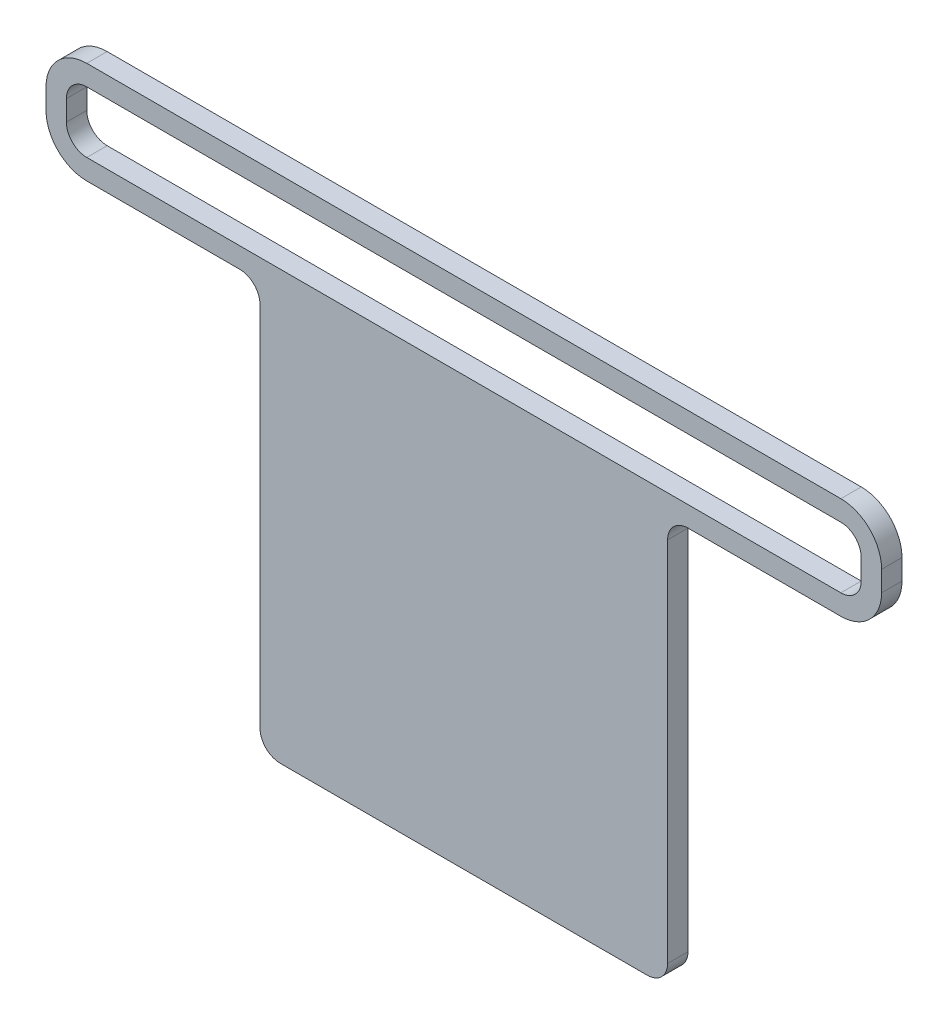
ISO-10303-21;
HEADER;
FILE_DESCRIPTION(('STEP AP214'),'2;1');
FILE_NAME('part.step','',(''),(''),'','','');
FILE_SCHEMA(('AUTOMOTIVE_DESIGN { 1 0 10303 214 1 1 1 1 }'));
ENDSEC;
DATA;
#1=APPLICATION_CONTEXT('core data for automotive mechanical design processes');
#2=APPLICATION_PROTOCOL_DEFINITION('international standard','automotive_design',2000,#1);
#3=PRODUCT_CONTEXT('',#1,'mechanical');
#4=PRODUCT('Part','Part','',(#3));
#5=PRODUCT_RELATED_PRODUCT_CATEGORY('part','',(#4));
#6=PRODUCT_DEFINITION_FORMATION('','',#4);
#7=PRODUCT_DEFINITION_CONTEXT('part definition',#1,'design');
#8=PRODUCT_DEFINITION('design','',#6,#7);
#9=PRODUCT_DEFINITION_SHAPE('','',#8);
#10=(LENGTH_UNIT() NAMED_UNIT(*) SI_UNIT(.MILLI.,.METRE.));
#11=(NAMED_UNIT(*) PLANE_ANGLE_UNIT() SI_UNIT($,.RADIAN.));
#12=(NAMED_UNIT(*) SI_UNIT($,.STERADIAN.) SOLID_ANGLE_UNIT());
#13=UNCERTAINTY_MEASURE_WITH_UNIT(LENGTH_MEASURE(1.E-05),#10,'distance_accuracy_value','');
#14=(GEOMETRIC_REPRESENTATION_CONTEXT(3) GLOBAL_UNCERTAINTY_ASSIGNED_CONTEXT((#13)) GLOBAL_UNIT_ASSIGNED_CONTEXT((#10,
#11,#12)) REPRESENTATION_CONTEXT('',''));
#15=CARTESIAN_POINT('',(0.,0.,0.));
#16=DIRECTION('',(0.,0.,1.));
#17=DIRECTION('',(1.,0.,0.));
#18=AXIS2_PLACEMENT_3D('',#15,#16,#17);
#19=CARTESIAN_POINT('',(143.204419889503,15.,5.));
#20=DIRECTION('',(0.,0.,-1.));
#21=DIRECTION('',(-1.,0.,0.));
#22=AXIS2_PLACEMENT_3D('',#19,#20,#21);
#23=PLANE('',#22);
#24=CARTESIAN_POINT('',(143.204419889503,15.,5.));
#25=DIRECTION('',(0.,0.,1.));
#26=DIRECTION('',(-1.,0.,0.));
#27=AXIS2_PLACEMENT_3D('',#24,#25,#26);
#28=CIRCLE('',#27,10.);
#29=CARTESIAN_POINT('',(153.204419889503,15.,5.));
#30=VERTEX_POINT('',#29);
#31=CARTESIAN_POINT('',(143.204419889503,25.,5.));
#32=VERTEX_POINT('',#31);
#33=EDGE_CURVE('E261',#30,#32,#28,.T.);
#34=ORIENTED_EDGE('',*,*,#33,.T.);
#35=DIRECTION('',(-1.,0.,0.));
#36=VECTOR('',#35,1.);
#37=CARTESIAN_POINT('',(-41.7955801104972,25.,5.));
#38=LINE('',#37,#36);
#39=CARTESIAN_POINT('',(-41.7955801104972,25.,5.));
#40=VERTEX_POINT('',#39);
#41=EDGE_CURVE('E264',#32,#40,#38,.T.);
#42=ORIENTED_EDGE('',*,*,#41,.T.);
#43=CARTESIAN_POINT('',(-41.7955801104972,15.,5.));
#44=DIRECTION('',(0.,0.,1.));
#45=DIRECTION('',(1.,0.,0.));
#46=AXIS2_PLACEMENT_3D('',#43,#44,#45);
#47=CIRCLE('',#46,10.);
#48=CARTESIAN_POINT('',(-51.7955801104972,14.9999999999999,5.));
#49=VERTEX_POINT('',#48);
#50=EDGE_CURVE('E267',#40,#49,#47,.T.);
#51=ORIENTED_EDGE('',*,*,#50,.T.);
#52=DIRECTION('',(0.,-1.,0.));
#53=VECTOR('',#52,1.);
#54=CARTESIAN_POINT('',(-51.7955801104972,14.9999999999999,5.));
#55=LINE('',#54,#53);
#56=CARTESIAN_POINT('',(-51.7955801104972,10.0000000000001,5.));
#57=VERTEX_POINT('',#56);
#58=EDGE_CURVE('E269',#49,#57,#55,.T.);
#59=ORIENTED_EDGE('',*,*,#58,.T.);
#60=CARTESIAN_POINT('',(-41.7955801104972,10.,5.));
#61=DIRECTION('',(0.,0.,1.));
#62=DIRECTION('',(1.,0.,0.));
#63=AXIS2_PLACEMENT_3D('',#60,#61,#62);
#64=CIRCLE('',#63,10.);
#65=CARTESIAN_POINT('',(-41.7955801104972,0.,5.));
#66=VERTEX_POINT('',#65);
#67=EDGE_CURVE('E271',#57,#66,#64,.T.);
#68=ORIENTED_EDGE('',*,*,#67,.T.);
#69=DIRECTION('',(1.,0.,0.));
#70=VECTOR('',#69,1.);
#71=CARTESIAN_POINT('',(-41.7955801104972,0.,5.));
#72=LINE('',#71,#70);
#73=CARTESIAN_POINT('',(-4.29558011049723,0.,5.));
#74=VERTEX_POINT('',#73);
#75=EDGE_CURVE('E273',#66,#74,#72,.T.);
#76=ORIENTED_EDGE('',*,*,#75,.T.);
#77=CARTESIAN_POINT('',(-4.29558011049723,-5.,5.));
#78=DIRECTION('',(0.,0.,-1.));
#79=DIRECTION('',(-1.,0.,0.));
#80=AXIS2_PLACEMENT_3D('',#77,#78,#79);
#81=CIRCLE('',#80,5.);
#82=CARTESIAN_POINT('',(0.704419889502775,-5.,5.));
#83=VERTEX_POINT('',#82);
#84=EDGE_CURVE('E275',#74,#83,#81,.T.);
#85=ORIENTED_EDGE('',*,*,#84,.T.);
#86=DIRECTION('',(0.,-1.,0.));
#87=VECTOR('',#86,1.);
#88=CARTESIAN_POINT('',(0.704419889502775,-5.,5.));
#89=LINE('',#88,#87);
#90=CARTESIAN_POINT('',(0.704419889502785,-95.,5.));
#91=VERTEX_POINT('',#90);
#92=EDGE_CURVE('E277',#83,#91,#89,.T.);
#93=ORIENTED_EDGE('',*,*,#92,.T.);
#94=CARTESIAN_POINT('',(5.70441988950279,-95.,5.));
#95=DIRECTION('',(0.,0.,1.));
#96=DIRECTION('',(1.,0.,0.));
#97=AXIS2_PLACEMENT_3D('',#94,#95,#96);
#98=CIRCLE('',#97,5.);
#99=CARTESIAN_POINT('',(5.70441988950278,-100.,5.));
#100=VERTEX_POINT('',#99);
#101=EDGE_CURVE('E279',#91,#100,#98,.T.);
#102=ORIENTED_EDGE('',*,*,#101,.T.);
#103=DIRECTION('',(1.,0.,0.));
#104=VECTOR('',#103,1.);
#105=CARTESIAN_POINT('',(5.70441988950279,-100.,5.));
#106=LINE('',#105,#104);
#107=CARTESIAN_POINT('',(95.7044198895028,-100.,5.));
#108=VERTEX_POINT('',#107);
#109=EDGE_CURVE('E281',#100,#108,#106,.T.);
#110=ORIENTED_EDGE('',*,*,#109,.T.);
#111=CARTESIAN_POINT('',(95.7044198895028,-95.,5.));
#112=DIRECTION('',(0.,0.,1.));
#113=DIRECTION('',(1.,0.,0.));
#114=AXIS2_PLACEMENT_3D('',#111,#112,#113);
#115=CIRCLE('',#114,5.);
#116=CARTESIAN_POINT('',(100.704419889503,-95.,5.));
#117=VERTEX_POINT('',#116);
#118=EDGE_CURVE('E283',#108,#117,#115,.T.);
#119=ORIENTED_EDGE('',*,*,#118,.T.);
#120=DIRECTION('',(0.,1.,0.));
#121=VECTOR('',#120,1.);
#122=CARTESIAN_POINT('',(100.704419889503,-5.,5.));
#123=LINE('',#122,#121);
#124=CARTESIAN_POINT('',(100.704419889503,-5.,5.));
#125=VERTEX_POINT('',#124);
#126=EDGE_CURVE('E285',#117,#125,#123,.T.);
#127=ORIENTED_EDGE('',*,*,#126,.T.);
#128=CARTESIAN_POINT('',(105.704419889503,-5.,5.));
#129=DIRECTION('',(0.,0.,-1.));
#130=DIRECTION('',(1.,0.,0.));
#131=AXIS2_PLACEMENT_3D('',#128,#129,#130);
#132=CIRCLE('',#131,5.);
#133=CARTESIAN_POINT('',(105.704419889503,0.,5.));
#134=VERTEX_POINT('',#133);
#135=EDGE_CURVE('E287',#125,#134,#132,.T.);
#136=ORIENTED_EDGE('',*,*,#135,.T.);
#137=DIRECTION('',(1.,0.,0.));
#138=VECTOR('',#137,1.);
#139=CARTESIAN_POINT('',(105.704419889503,0.,5.));
#140=LINE('',#139,#138);
#141=CARTESIAN_POINT('',(143.204419889503,0.,5.));
#142=VERTEX_POINT('',#141);
#143=EDGE_CURVE('E289',#134,#142,#140,.T.);
#144=ORIENTED_EDGE('',*,*,#143,.T.);
#145=CARTESIAN_POINT('',(143.204419889503,10.,5.));
#146=DIRECTION('',(0.,0.,1.));
#147=DIRECTION('',(1.,0.,0.));
#148=AXIS2_PLACEMENT_3D('',#145,#146,#147);
#149=CIRCLE('',#148,10.);
#150=CARTESIAN_POINT('',(153.204419889503,10.,5.));
#151=VERTEX_POINT('',#150);
#152=EDGE_CURVE('E291',#142,#151,#149,.T.);
#153=ORIENTED_EDGE('',*,*,#152,.T.);
#154=DIRECTION('',(0.,1.,0.));
#155=VECTOR('',#154,1.);
#156=CARTESIAN_POINT('',(153.204419889503,15.,5.));
#157=LINE('',#156,#155);
#158=EDGE_CURVE('E293',#151,#30,#157,.T.);
#159=ORIENTED_EDGE('',*,*,#158,.T.);
#160=EDGE_LOOP('',(#34,#42,#51,#59,#68,#76,#85,#93,#102,#110,#119,#127,#136,#144,#153,#159));
#161=FACE_BOUND('',#160,.T.);
#162=CARTESIAN_POINT('',(-41.7955801104972,15.,5.));
#163=DIRECTION('',(0.,0.,1.));
#164=DIRECTION('',(1.,0.,0.));
#165=AXIS2_PLACEMENT_3D('',#162,#163,#164);
#166=CIRCLE('',#165,5.);
#167=CARTESIAN_POINT('',(-41.7955801104972,20.,5.));
#168=VERTEX_POINT('',#167);
#169=CARTESIAN_POINT('',(-46.7955801104972,15.,5.));
#170=VERTEX_POINT('',#169);
#171=EDGE_CURVE('E196',#168,#170,#166,.T.);
#172=ORIENTED_EDGE('',*,*,#171,.F.);
#173=DIRECTION('',(-1.,0.,0.));
#174=VECTOR('',#173,1.);
#175=CARTESIAN_POINT('',(-41.7955801104972,20.,5.));
#176=LINE('',#175,#174);
#177=CARTESIAN_POINT('',(143.204419889503,20.,5.));
#178=VERTEX_POINT('',#177);
#179=EDGE_CURVE('E229',#178,#168,#176,.T.);
#180=ORIENTED_EDGE('',*,*,#179,.F.);
#181=CARTESIAN_POINT('',(143.204419889503,15.,5.));
#182=DIRECTION('',(0.,0.,1.));
#183=DIRECTION('',(-1.,0.,0.));
#184=AXIS2_PLACEMENT_3D('',#181,#182,#183);
#185=CIRCLE('',#184,5.);
#186=CARTESIAN_POINT('',(148.204419889503,15.,5.));
#187=VERTEX_POINT('',#186);
#188=EDGE_CURVE('E227',#187,#178,#185,.T.);
#189=ORIENTED_EDGE('',*,*,#188,.F.);
#190=DIRECTION('',(0.,1.,0.));
#191=VECTOR('',#190,1.);
#192=CARTESIAN_POINT('',(148.204419889503,15.,5.));
#193=LINE('',#192,#191);
#194=CARTESIAN_POINT('',(148.204419889503,10.,5.));
#195=VERTEX_POINT('',#194);
#196=EDGE_CURVE('E225',#195,#187,#193,.T.);
#197=ORIENTED_EDGE('',*,*,#196,.F.);
#198=CARTESIAN_POINT('',(143.204419889503,10.,5.));
#199=DIRECTION('',(0.,0.,1.));
#200=DIRECTION('',(1.,0.,0.));
#201=AXIS2_PLACEMENT_3D('',#198,#199,#200);
#202=CIRCLE('',#201,5.);
#203=CARTESIAN_POINT('',(143.204419889503,5.,5.));
#204=VERTEX_POINT('',#203);
#205=EDGE_CURVE('E223',#204,#195,#202,.T.);
#206=ORIENTED_EDGE('',*,*,#205,.F.);
#207=DIRECTION('',(1.,0.,0.));
#208=VECTOR('',#207,1.);
#209=CARTESIAN_POINT('',(-41.7955801104972,5.,5.));
#210=LINE('',#209,#208);
#211=CARTESIAN_POINT('',(-41.7955801104972,5.,5.));
#212=VERTEX_POINT('',#211);
#213=EDGE_CURVE('E219',#212,#204,#210,.T.);
#214=ORIENTED_EDGE('',*,*,#213,.F.);
#215=CARTESIAN_POINT('',(-41.7955801104972,10.,5.));
#216=DIRECTION('',(0.,0.,1.));
#217=DIRECTION('',(1.,0.,0.));
#218=AXIS2_PLACEMENT_3D('',#215,#216,#217);
#219=CIRCLE('',#218,5.);
#220=CARTESIAN_POINT('',(-46.7955801104972,10.,5.));
#221=VERTEX_POINT('',#220);
#222=EDGE_CURVE('E217',#221,#212,#219,.T.);
#223=ORIENTED_EDGE('',*,*,#222,.F.);
#224=DIRECTION('',(0.,-1.,0.));
#225=VECTOR('',#224,1.);
#226=CARTESIAN_POINT('',(-46.7955801104972,15.,5.));
#227=LINE('',#226,#225);
#228=EDGE_CURVE('E204',#170,#221,#227,.T.);
#229=ORIENTED_EDGE('',*,*,#228,.F.);
#230=EDGE_LOOP('',(#172,#180,#189,#197,#206,#214,#223,#229));
#231=FACE_BOUND('',#230,.T.);
#232=ADVANCED_FACE('F35',(#161,#231),#23,.F.);
#233=CARTESIAN_POINT('',(143.204419889503,15.,0.));
#234=DIRECTION('',(0.,0.,-1.));
#235=DIRECTION('',(-1.,0.,0.));
#236=AXIS2_PLACEMENT_3D('',#233,#234,#235);
#237=PLANE('',#236);
#238=CARTESIAN_POINT('',(143.204419889503,15.,0.));
#239=DIRECTION('',(0.,0.,1.));
#240=DIRECTION('',(-1.,0.,0.));
#241=AXIS2_PLACEMENT_3D('',#238,#239,#240);
#242=CIRCLE('',#241,10.);
#243=CARTESIAN_POINT('',(153.204419889503,15.,0.));
#244=VERTEX_POINT('',#243);
#245=CARTESIAN_POINT('',(143.204419889503,25.,0.));
#246=VERTEX_POINT('',#245);
#247=EDGE_CURVE('E212',#244,#246,#242,.T.);
#248=ORIENTED_EDGE('',*,*,#247,.F.);
#249=DIRECTION('',(0.,1.,0.));
#250=VECTOR('',#249,1.);
#251=CARTESIAN_POINT('',(153.204419889503,15.,0.));
#252=LINE('',#251,#250);
#253=CARTESIAN_POINT('',(153.204419889503,10.,0.));
#254=VERTEX_POINT('',#253);
#255=EDGE_CURVE('E265',#254,#244,#252,.T.);
#256=ORIENTED_EDGE('',*,*,#255,.F.);
#257=CARTESIAN_POINT('',(143.204419889503,10.,0.));
#258=DIRECTION('',(0.,0.,1.));
#259=DIRECTION('',(1.,0.,0.));
#260=AXIS2_PLACEMENT_3D('',#257,#258,#259);
#261=CIRCLE('',#260,10.);
#262=CARTESIAN_POINT('',(143.204419889503,0.,0.));
#263=VERTEX_POINT('',#262);
#264=EDGE_CURVE('E324',#263,#254,#261,.T.);
#265=ORIENTED_EDGE('',*,*,#264,.F.);
#266=DIRECTION('',(1.,0.,0.));
#267=VECTOR('',#266,1.);
#268=CARTESIAN_POINT('',(105.704419889503,0.,0.));
#269=LINE('',#268,#267);
#270=CARTESIAN_POINT('',(105.704419889503,0.,0.));
#271=VERTEX_POINT('',#270);
#272=EDGE_CURVE('E322',#271,#263,#269,.T.);
#273=ORIENTED_EDGE('',*,*,#272,.F.);
#274=CARTESIAN_POINT('',(105.704419889503,-5.,0.));
#275=DIRECTION('',(0.,0.,-1.));
#276=DIRECTION('',(1.,0.,0.));
#277=AXIS2_PLACEMENT_3D('',#274,#275,#276);
#278=CIRCLE('',#277,5.);
#279=CARTESIAN_POINT('',(100.704419889503,-5.,0.));
#280=VERTEX_POINT('',#279);
#281=EDGE_CURVE('E320',#280,#271,#278,.T.);
#282=ORIENTED_EDGE('',*,*,#281,.F.);
#283=DIRECTION('',(0.,1.,0.));
#284=VECTOR('',#283,1.);
#285=CARTESIAN_POINT('',(100.704419889503,-5.,0.));
#286=LINE('',#285,#284);
#287=CARTESIAN_POINT('',(100.704419889503,-95.,0.));
#288=VERTEX_POINT('',#287);
#289=EDGE_CURVE('E318',#288,#280,#286,.T.);
#290=ORIENTED_EDGE('',*,*,#289,.F.);
#291=CARTESIAN_POINT('',(95.7044198895028,-95.,0.));
#292=DIRECTION('',(0.,0.,1.));
#293=DIRECTION('',(1.,0.,0.));
#294=AXIS2_PLACEMENT_3D('',#291,#292,#293);
#295=CIRCLE('',#294,5.);
#296=CARTESIAN_POINT('',(95.7044198895028,-100.,0.));
#297=VERTEX_POINT('',#296);
#298=EDGE_CURVE('E316',#297,#288,#295,.T.);
#299=ORIENTED_EDGE('',*,*,#298,.F.);
#300=DIRECTION('',(1.,0.,0.));
#301=VECTOR('',#300,1.);
#302=CARTESIAN_POINT('',(5.70441988950279,-100.,0.));
#303=LINE('',#302,#301);
#304=CARTESIAN_POINT('',(5.70441988950278,-100.,0.));
#305=VERTEX_POINT('',#304);
#306=EDGE_CURVE('E314',#305,#297,#303,.T.);
#307=ORIENTED_EDGE('',*,*,#306,.F.);
#308=CARTESIAN_POINT('',(5.70441988950279,-95.,0.));
#309=DIRECTION('',(0.,0.,1.));
#310=DIRECTION('',(1.,0.,0.));
#311=AXIS2_PLACEMENT_3D('',#308,#309,#310);
#312=CIRCLE('',#311,5.);
#313=CARTESIAN_POINT('',(0.704419889502785,-95.,0.));
#314=VERTEX_POINT('',#313);
#315=EDGE_CURVE('E312',#314,#305,#312,.T.);
#316=ORIENTED_EDGE('',*,*,#315,.F.);
#317=DIRECTION('',(0.,-1.,0.));
#318=VECTOR('',#317,1.);
#319=CARTESIAN_POINT('',(0.704419889502775,-5.,0.));
#320=LINE('',#319,#318);
#321=CARTESIAN_POINT('',(0.704419889502775,-5.,0.));
#322=VERTEX_POINT('',#321);
#323=EDGE_CURVE('E310',#322,#314,#320,.T.);
#324=ORIENTED_EDGE('',*,*,#323,.F.);
#325=CARTESIAN_POINT('',(-4.29558011049723,-5.,0.));
#326=DIRECTION('',(0.,0.,-1.));
#327=DIRECTION('',(-1.,0.,0.));
#328=AXIS2_PLACEMENT_3D('',#325,#326,#327);
#329=CIRCLE('',#328,5.);
#330=CARTESIAN_POINT('',(-4.29558011049723,0.,0.));
#331=VERTEX_POINT('',#330);
#332=EDGE_CURVE('E308',#331,#322,#329,.T.);
#333=ORIENTED_EDGE('',*,*,#332,.F.);
#334=DIRECTION('',(1.,0.,0.));
#335=VECTOR('',#334,1.);
#336=CARTESIAN_POINT('',(-41.7955801104972,0.,0.));
#337=LINE('',#336,#335);
#338=CARTESIAN_POINT('',(-41.7955801104972,0.,0.));
#339=VERTEX_POINT('',#338);
#340=EDGE_CURVE('E306',#339,#331,#337,.T.);
#341=ORIENTED_EDGE('',*,*,#340,.F.);
#342=CARTESIAN_POINT('',(-41.7955801104972,10.,0.));
#343=DIRECTION('',(0.,0.,1.));
#344=DIRECTION('',(1.,0.,0.));
#345=AXIS2_PLACEMENT_3D('',#342,#343,#344);
#346=CIRCLE('',#345,10.);
#347=CARTESIAN_POINT('',(-51.7955801104972,10.0000000000001,0.));
#348=VERTEX_POINT('',#347);
#349=EDGE_CURVE('E304',#348,#339,#346,.T.);
#350=ORIENTED_EDGE('',*,*,#349,.F.);
#351=DIRECTION('',(0.,-1.,0.));
#352=VECTOR('',#351,1.);
#353=CARTESIAN_POINT('',(-51.7955801104972,14.9999999999999,0.));
#354=LINE('',#353,#352);
#355=CARTESIAN_POINT('',(-51.7955801104972,14.9999999999999,0.));
#356=VERTEX_POINT('',#355);
#357=EDGE_CURVE('E302',#356,#348,#354,.T.);
#358=ORIENTED_EDGE('',*,*,#357,.F.);
#359=CARTESIAN_POINT('',(-41.7955801104972,15.,0.));
#360=DIRECTION('',(0.,0.,1.));
#361=DIRECTION('',(1.,0.,0.));
#362=AXIS2_PLACEMENT_3D('',#359,#360,#361);
#363=CIRCLE('',#362,10.);
#364=CARTESIAN_POINT('',(-41.7955801104972,25.,0.));
#365=VERTEX_POINT('',#364);
#366=EDGE_CURVE('E300',#365,#356,#363,.T.);
#367=ORIENTED_EDGE('',*,*,#366,.F.);
#368=DIRECTION('',(-1.,0.,0.));
#369=VECTOR('',#368,1.);
#370=CARTESIAN_POINT('',(-41.7955801104972,25.,0.));
#371=LINE('',#370,#369);
#372=EDGE_CURVE('E298',#246,#365,#371,.T.);
#373=ORIENTED_EDGE('',*,*,#372,.F.);
#374=EDGE_LOOP('',(#248,#256,#265,#273,#282,#290,#299,#307,#316,#324,#333,#341,#350,#358,#367,#373));
#375=FACE_BOUND('',#374,.T.);
#376=DIRECTION('',(-1.,0.,0.));
#377=VECTOR('',#376,1.);
#378=CARTESIAN_POINT('',(-41.7955801104972,20.,0.));
#379=LINE('',#378,#377);
#380=CARTESIAN_POINT('',(143.204419889503,20.,0.));
#381=VERTEX_POINT('',#380);
#382=CARTESIAN_POINT('',(-41.7955801104972,20.,0.));
#383=VERTEX_POINT('',#382);
#384=EDGE_CURVE('E205',#381,#383,#379,.T.);
#385=ORIENTED_EDGE('',*,*,#384,.T.);
#386=CARTESIAN_POINT('',(-41.7955801104972,15.,0.));
#387=DIRECTION('',(0.,0.,1.));
#388=DIRECTION('',(1.,0.,0.));
#389=AXIS2_PLACEMENT_3D('',#386,#387,#388);
#390=CIRCLE('',#389,5.);
#391=CARTESIAN_POINT('',(-46.7955801104972,15.,0.));
#392=VERTEX_POINT('',#391);
#393=EDGE_CURVE('E58',#383,#392,#390,.T.);
#394=ORIENTED_EDGE('',*,*,#393,.T.);
#395=DIRECTION('',(0.,-1.,0.));
#396=VECTOR('',#395,1.);
#397=CARTESIAN_POINT('',(-46.7955801104972,15.,0.));
#398=LINE('',#397,#396);
#399=CARTESIAN_POINT('',(-46.7955801104972,10.,0.));
#400=VERTEX_POINT('',#399);
#401=EDGE_CURVE('E211',#392,#400,#398,.T.);
#402=ORIENTED_EDGE('',*,*,#401,.T.);
#403=CARTESIAN_POINT('',(-41.7955801104972,10.,0.));
#404=DIRECTION('',(0.,0.,1.));
#405=DIRECTION('',(1.,0.,0.));
#406=AXIS2_PLACEMENT_3D('',#403,#404,#405);
#407=CIRCLE('',#406,5.);
#408=CARTESIAN_POINT('',(-41.7955801104972,5.,0.));
#409=VERTEX_POINT('',#408);
#410=EDGE_CURVE('E233',#400,#409,#407,.T.);
#411=ORIENTED_EDGE('',*,*,#410,.T.);
#412=DIRECTION('',(1.,0.,0.));
#413=VECTOR('',#412,1.);
#414=CARTESIAN_POINT('',(-41.7955801104972,5.,0.));
#415=LINE('',#414,#413);
#416=CARTESIAN_POINT('',(143.204419889503,5.,0.));
#417=VERTEX_POINT('',#416);
#418=EDGE_CURVE('E236',#409,#417,#415,.T.);
#419=ORIENTED_EDGE('',*,*,#418,.T.);
#420=CARTESIAN_POINT('',(143.204419889503,10.,0.));
#421=DIRECTION('',(0.,0.,1.));
#422=DIRECTION('',(1.,0.,0.));
#423=AXIS2_PLACEMENT_3D('',#420,#421,#422);
#424=CIRCLE('',#423,5.);
#425=CARTESIAN_POINT('',(148.204419889503,10.,0.));
#426=VERTEX_POINT('',#425);
#427=EDGE_CURVE('E239',#417,#426,#424,.T.);
#428=ORIENTED_EDGE('',*,*,#427,.T.);
#429=DIRECTION('',(0.,1.,0.));
#430=VECTOR('',#429,1.);
#431=CARTESIAN_POINT('',(148.204419889503,15.,0.));
#432=LINE('',#431,#430);
#433=CARTESIAN_POINT('',(148.204419889503,15.,0.));
#434=VERTEX_POINT('',#433);
#435=EDGE_CURVE('E242',#426,#434,#432,.T.);
#436=ORIENTED_EDGE('',*,*,#435,.T.);
#437=CARTESIAN_POINT('',(143.204419889503,15.,0.));
#438=DIRECTION('',(0.,0.,1.));
#439=DIRECTION('',(-1.,0.,0.));
#440=AXIS2_PLACEMENT_3D('',#437,#438,#439);
#441=CIRCLE('',#440,5.);
#442=EDGE_CURVE('E245',#434,#381,#441,.T.);
#443=ORIENTED_EDGE('',*,*,#442,.T.);
#444=EDGE_LOOP('',(#385,#394,#402,#411,#419,#428,#436,#443));
#445=FACE_BOUND('',#444,.T.);
#446=ADVANCED_FACE('F378',(#375,#445),#237,.T.);
#447=CARTESIAN_POINT('',(143.204419889503,15.,5.));
#448=DIRECTION('',(0.,0.,-1.));
#449=DIRECTION('',(-1.,0.,0.));
#450=AXIS2_PLACEMENT_3D('',#447,#448,#449);
#451=CYLINDRICAL_SURFACE('',#450,10.);
#452=ORIENTED_EDGE('',*,*,#247,.T.);
#453=DIRECTION('',(0.,0.,-1.));
#454=VECTOR('',#453,1.);
#455=CARTESIAN_POINT('',(143.204419889503,25.,5.));
#456=LINE('',#455,#454);
#457=EDGE_CURVE('E11',#32,#246,#456,.T.);
#458=ORIENTED_EDGE('',*,*,#457,.F.);
#459=ORIENTED_EDGE('',*,*,#33,.F.);
#460=DIRECTION('',(0.,0.,-1.));
#461=VECTOR('',#460,1.);
#462=CARTESIAN_POINT('',(153.204419889503,15.,5.));
#463=LINE('',#462,#461);
#464=EDGE_CURVE('E295',#30,#244,#463,.T.);
#465=ORIENTED_EDGE('',*,*,#464,.T.);
#466=EDGE_LOOP('',(#452,#458,#459,#465));
#467=FACE_BOUND('',#466,.T.);
#468=ADVANCED_FACE('F37',(#467),#451,.T.);
#469=CARTESIAN_POINT('',(-41.7955801104972,25.,5.));
#470=DIRECTION('',(0.,-1.,0.));
#471=DIRECTION('',(0.,0.,-1.));
#472=AXIS2_PLACEMENT_3D('',#469,#470,#471);
#473=PLANE('',#472);
#474=ORIENTED_EDGE('',*,*,#372,.T.);
#475=DIRECTION('',(0.,0.,-1.));
#476=VECTOR('',#475,1.);
#477=CARTESIAN_POINT('',(-41.7955801104972,25.,5.));
#478=LINE('',#477,#476);
#479=EDGE_CURVE('E43',#40,#365,#478,.T.);
#480=ORIENTED_EDGE('',*,*,#479,.F.);
#481=ORIENTED_EDGE('',*,*,#41,.F.);
#482=ORIENTED_EDGE('',*,*,#457,.T.);
#483=EDGE_LOOP('',(#474,#480,#481,#482));
#484=FACE_BOUND('',#483,.T.);
#485=ADVANCED_FACE('F395',(#484),#473,.F.);
#486=CARTESIAN_POINT('',(-41.7955801104972,15.,5.));
#487=DIRECTION('',(0.,0.,-1.));
#488=DIRECTION('',(-1.,0.,0.));
#489=AXIS2_PLACEMENT_3D('',#486,#487,#488);
#490=CYLINDRICAL_SURFACE('',#489,10.);
#491=ORIENTED_EDGE('',*,*,#366,.T.);
#492=DIRECTION('',(0.,0.,-1.));
#493=VECTOR('',#492,1.);
#494=CARTESIAN_POINT('',(-51.7955801104972,14.9999999999999,5.));
#495=LINE('',#494,#493);
#496=EDGE_CURVE('E365',#49,#356,#495,.T.);
#497=ORIENTED_EDGE('',*,*,#496,.F.);
#498=ORIENTED_EDGE('',*,*,#50,.F.);
#499=ORIENTED_EDGE('',*,*,#479,.T.);
#500=EDGE_LOOP('',(#491,#497,#498,#499));
#501=FACE_BOUND('',#500,.T.);
#502=ADVANCED_FACE('F372',(#501),#490,.T.);
#503=CARTESIAN_POINT('',(-51.7955801104972,14.9999999999999,5.));
#504=DIRECTION('',(1.,0.,0.));
#505=DIRECTION('',(0.,0.,-1.));
#506=AXIS2_PLACEMENT_3D('',#503,#504,#505);
#507=PLANE('',#506);
#508=ORIENTED_EDGE('',*,*,#357,.T.);
#509=DIRECTION('',(0.,0.,-1.));
#510=VECTOR('',#509,1.);
#511=CARTESIAN_POINT('',(-51.7955801104972,10.0000000000001,5.));
#512=LINE('',#511,#510);
#513=EDGE_CURVE('E362',#57,#348,#512,.T.);
#514=ORIENTED_EDGE('',*,*,#513,.F.);
#515=ORIENTED_EDGE('',*,*,#58,.F.);
#516=ORIENTED_EDGE('',*,*,#496,.T.);
#517=EDGE_LOOP('',(#508,#514,#515,#516));
#518=FACE_BOUND('',#517,.T.);
#519=ADVANCED_FACE('F384',(#518),#507,.F.);
#520=CARTESIAN_POINT('',(-41.7955801104972,10.,5.));
#521=DIRECTION('',(0.,0.,-1.));
#522=DIRECTION('',(-1.,0.,0.));
#523=AXIS2_PLACEMENT_3D('',#520,#521,#522);
#524=CYLINDRICAL_SURFACE('',#523,10.);
#525=ORIENTED_EDGE('',*,*,#349,.T.);
#526=DIRECTION('',(0.,0.,-1.));
#527=VECTOR('',#526,1.);
#528=CARTESIAN_POINT('',(-41.7955801104972,0.,5.));
#529=LINE('',#528,#527);
#530=EDGE_CURVE('E359',#66,#339,#529,.T.);
#531=ORIENTED_EDGE('',*,*,#530,.F.);
#532=ORIENTED_EDGE('',*,*,#67,.F.);
#533=ORIENTED_EDGE('',*,*,#513,.T.);
#534=EDGE_LOOP('',(#525,#531,#532,#533));
#535=FACE_BOUND('',#534,.T.);
#536=ADVANCED_FACE('F388',(#535),#524,.T.);
#537=CARTESIAN_POINT('',(-41.7955801104972,0.,5.));
#538=DIRECTION('',(0.,1.,0.));
#539=DIRECTION('',(0.,0.,1.));
#540=AXIS2_PLACEMENT_3D('',#537,#538,#539);
#541=PLANE('',#540);
#542=ORIENTED_EDGE('',*,*,#340,.T.);
#543=DIRECTION('',(0.,0.,-1.));
#544=VECTOR('',#543,1.);
#545=CARTESIAN_POINT('',(-4.29558011049723,0.,5.));
#546=LINE('',#545,#544);
#547=EDGE_CURVE('E356',#74,#331,#546,.T.);
#548=ORIENTED_EDGE('',*,*,#547,.F.);
#549=ORIENTED_EDGE('',*,*,#75,.F.);
#550=ORIENTED_EDGE('',*,*,#530,.T.);
#551=EDGE_LOOP('',(#542,#548,#549,#550));
#552=FACE_BOUND('',#551,.T.);
#553=ADVANCED_FACE('F448',(#552),#541,.F.);
#554=CARTESIAN_POINT('',(-4.29558011049723,-5.,5.));
#555=DIRECTION('',(0.,0.,-1.));
#556=DIRECTION('',(-1.,0.,0.));
#557=AXIS2_PLACEMENT_3D('',#554,#555,#556);
#558=CYLINDRICAL_SURFACE('',#557,5.);
#559=ORIENTED_EDGE('',*,*,#332,.T.);
#560=DIRECTION('',(0.,0.,-1.));
#561=VECTOR('',#560,1.);
#562=CARTESIAN_POINT('',(0.704419889502775,-5.,5.));
#563=LINE('',#562,#561);
#564=EDGE_CURVE('E353',#83,#322,#563,.T.);
#565=ORIENTED_EDGE('',*,*,#564,.F.);
#566=ORIENTED_EDGE('',*,*,#84,.F.);
#567=ORIENTED_EDGE('',*,*,#547,.T.);
#568=EDGE_LOOP('',(#559,#565,#566,#567));
#569=FACE_BOUND('',#568,.T.);
#570=ADVANCED_FACE('F445',(#569),#558,.F.);
#571=CARTESIAN_POINT('',(0.704419889502775,-5.,5.));
#572=DIRECTION('',(1.,0.,0.));
#573=DIRECTION('',(0.,1.,0.));
#574=AXIS2_PLACEMENT_3D('',#571,#572,#573);
#575=PLANE('',#574);
#576=ORIENTED_EDGE('',*,*,#323,.T.);
#577=DIRECTION('',(0.,0.,-1.));
#578=VECTOR('',#577,1.);
#579=CARTESIAN_POINT('',(0.704419889502785,-95.,5.));
#580=LINE('',#579,#578);
#581=EDGE_CURVE('E350',#91,#314,#580,.T.);
#582=ORIENTED_EDGE('',*,*,#581,.F.);
#583=ORIENTED_EDGE('',*,*,#92,.F.);
#584=ORIENTED_EDGE('',*,*,#564,.T.);
#585=EDGE_LOOP('',(#576,#582,#583,#584));
#586=FACE_BOUND('',#585,.T.);
#587=ADVANCED_FACE('F441',(#586),#575,.F.);
#588=CARTESIAN_POINT('',(5.70441988950279,-95.,5.));
#589=DIRECTION('',(0.,0.,-1.));
#590=DIRECTION('',(-1.,0.,0.));
#591=AXIS2_PLACEMENT_3D('',#588,#589,#590);
#592=CYLINDRICAL_SURFACE('',#591,5.);
#593=ORIENTED_EDGE('',*,*,#315,.T.);
#594=DIRECTION('',(0.,0.,-1.));
#595=VECTOR('',#594,1.);
#596=CARTESIAN_POINT('',(5.70441988950278,-100.,5.));
#597=LINE('',#596,#595);
#598=EDGE_CURVE('E347',#100,#305,#597,.T.);
#599=ORIENTED_EDGE('',*,*,#598,.F.);
#600=ORIENTED_EDGE('',*,*,#101,.F.);
#601=ORIENTED_EDGE('',*,*,#581,.T.);
#602=EDGE_LOOP('',(#593,#599,#600,#601));
#603=FACE_BOUND('',#602,.T.);
#604=ADVANCED_FACE('F437',(#603),#592,.T.);
#605=CARTESIAN_POINT('',(5.70441988950279,-100.,5.));
#606=DIRECTION('',(0.,1.,0.));
#607=DIRECTION('',(0.,0.,1.));
#608=AXIS2_PLACEMENT_3D('',#605,#606,#607);
#609=PLANE('',#608);
#610=ORIENTED_EDGE('',*,*,#306,.T.);
#611=DIRECTION('',(0.,0.,-1.));
#612=VECTOR('',#611,1.);
#613=CARTESIAN_POINT('',(95.7044198895028,-100.,5.));
#614=LINE('',#613,#612);
#615=EDGE_CURVE('E344',#108,#297,#614,.T.);
#616=ORIENTED_EDGE('',*,*,#615,.F.);
#617=ORIENTED_EDGE('',*,*,#109,.F.);
#618=ORIENTED_EDGE('',*,*,#598,.T.);
#619=EDGE_LOOP('',(#610,#616,#617,#618));
#620=FACE_BOUND('',#619,.T.);
#621=ADVANCED_FACE('F432',(#620),#609,.F.);
#622=CARTESIAN_POINT('',(95.7044198895028,-95.,5.));
#623=DIRECTION('',(0.,0.,-1.));
#624=DIRECTION('',(-1.,0.,0.));
#625=AXIS2_PLACEMENT_3D('',#622,#623,#624);
#626=CYLINDRICAL_SURFACE('',#625,5.);
#627=ORIENTED_EDGE('',*,*,#298,.T.);
#628=DIRECTION('',(0.,0.,-1.));
#629=VECTOR('',#628,1.);
#630=CARTESIAN_POINT('',(100.704419889503,-95.,5.));
#631=LINE('',#630,#629);
#632=EDGE_CURVE('E341',#117,#288,#631,.T.);
#633=ORIENTED_EDGE('',*,*,#632,.F.);
#634=ORIENTED_EDGE('',*,*,#118,.F.);
#635=ORIENTED_EDGE('',*,*,#615,.T.);
#636=EDGE_LOOP('',(#627,#633,#634,#635));
#637=FACE_BOUND('',#636,.T.);
#638=ADVANCED_FACE('F426',(#637),#626,.T.);
#639=CARTESIAN_POINT('',(100.704419889503,-5.,5.));
#640=DIRECTION('',(-1.,0.,0.));
#641=DIRECTION('',(0.,-1.,0.));
#642=AXIS2_PLACEMENT_3D('',#639,#640,#641);
#643=PLANE('',#642);
#644=ORIENTED_EDGE('',*,*,#289,.T.);
#645=DIRECTION('',(0.,0.,-1.));
#646=VECTOR('',#645,1.);
#647=CARTESIAN_POINT('',(100.704419889503,-5.,5.));
#648=LINE('',#647,#646);
#649=EDGE_CURVE('E338',#125,#280,#648,.T.);
#650=ORIENTED_EDGE('',*,*,#649,.F.);
#651=ORIENTED_EDGE('',*,*,#126,.F.);
#652=ORIENTED_EDGE('',*,*,#632,.T.);
#653=EDGE_LOOP('',(#644,#650,#651,#652));
#654=FACE_BOUND('',#653,.T.);
#655=ADVANCED_FACE('F422',(#654),#643,.F.);
#656=CARTESIAN_POINT('',(105.704419889503,-5.,5.));
#657=DIRECTION('',(0.,0.,-1.));
#658=DIRECTION('',(-1.,0.,0.));
#659=AXIS2_PLACEMENT_3D('',#656,#657,#658);
#660=CYLINDRICAL_SURFACE('',#659,5.);
#661=ORIENTED_EDGE('',*,*,#281,.T.);
#662=DIRECTION('',(0.,0.,-1.));
#663=VECTOR('',#662,1.);
#664=CARTESIAN_POINT('',(105.704419889503,0.,5.));
#665=LINE('',#664,#663);
#666=EDGE_CURVE('E335',#134,#271,#665,.T.);
#667=ORIENTED_EDGE('',*,*,#666,.F.);
#668=ORIENTED_EDGE('',*,*,#135,.F.);
#669=ORIENTED_EDGE('',*,*,#649,.T.);
#670=EDGE_LOOP('',(#661,#667,#668,#669));
#671=FACE_BOUND('',#670,.T.);
#672=ADVANCED_FACE('F417',(#671),#660,.F.);
#673=CARTESIAN_POINT('',(105.704419889503,0.,5.));
#674=DIRECTION('',(0.,1.,0.));
#675=DIRECTION('',(0.,0.,1.));
#676=AXIS2_PLACEMENT_3D('',#673,#674,#675);
#677=PLANE('',#676);
#678=ORIENTED_EDGE('',*,*,#272,.T.);
#679=DIRECTION('',(0.,0.,-1.));
#680=VECTOR('',#679,1.);
#681=CARTESIAN_POINT('',(143.204419889503,0.,5.));
#682=LINE('',#681,#680);
#683=EDGE_CURVE('E332',#142,#263,#682,.T.);
#684=ORIENTED_EDGE('',*,*,#683,.F.);
#685=ORIENTED_EDGE('',*,*,#143,.F.);
#686=ORIENTED_EDGE('',*,*,#666,.T.);
#687=EDGE_LOOP('',(#678,#684,#685,#686));
#688=FACE_BOUND('',#687,.T.);
#689=ADVANCED_FACE('F411',(#688),#677,.F.);
#690=CARTESIAN_POINT('',(143.204419889503,10.,5.));
#691=DIRECTION('',(0.,0.,-1.));
#692=DIRECTION('',(-1.,0.,0.));
#693=AXIS2_PLACEMENT_3D('',#690,#691,#692);
#694=CYLINDRICAL_SURFACE('',#693,10.);
#695=ORIENTED_EDGE('',*,*,#264,.T.);
#696=DIRECTION('',(0.,0.,-1.));
#697=VECTOR('',#696,1.);
#698=CARTESIAN_POINT('',(153.204419889503,10.,5.));
#699=LINE('',#698,#697);
#700=EDGE_CURVE('E329',#151,#254,#699,.T.);
#701=ORIENTED_EDGE('',*,*,#700,.F.);
#702=ORIENTED_EDGE('',*,*,#152,.F.);
#703=ORIENTED_EDGE('',*,*,#683,.T.);
#704=EDGE_LOOP('',(#695,#701,#702,#703));
#705=FACE_BOUND('',#704,.T.);
#706=ADVANCED_FACE('F407',(#705),#694,.T.);
#707=CARTESIAN_POINT('',(153.204419889503,15.,5.));
#708=DIRECTION('',(-1.,0.,0.));
#709=DIRECTION('',(0.,0.,1.));
#710=AXIS2_PLACEMENT_3D('',#707,#708,#709);
#711=PLANE('',#710);
#712=ORIENTED_EDGE('',*,*,#255,.T.);
#713=ORIENTED_EDGE('',*,*,#464,.F.);
#714=ORIENTED_EDGE('',*,*,#158,.F.);
#715=ORIENTED_EDGE('',*,*,#700,.T.);
#716=EDGE_LOOP('',(#712,#713,#714,#715));
#717=FACE_BOUND('',#716,.T.);
#718=ADVANCED_FACE('F402',(#717),#711,.F.);
#719=CARTESIAN_POINT('',(-41.7955801104972,15.,5.));
#720=DIRECTION('',(0.,0.,-1.));
#721=DIRECTION('',(-1.,0.,0.));
#722=AXIS2_PLACEMENT_3D('',#719,#720,#721);
#723=CYLINDRICAL_SURFACE('',#722,5.);
#724=ORIENTED_EDGE('',*,*,#393,.F.);
#725=DIRECTION('',(0.,0.,-1.));
#726=VECTOR('',#725,1.);
#727=CARTESIAN_POINT('',(-41.7955801104972,20.,5.));
#728=LINE('',#727,#726);
#729=EDGE_CURVE('E200',#168,#383,#728,.T.);
#730=ORIENTED_EDGE('',*,*,#729,.F.);
#731=ORIENTED_EDGE('',*,*,#171,.T.);
#732=DIRECTION('',(0.,0.,-1.));
#733=VECTOR('',#732,1.);
#734=CARTESIAN_POINT('',(-46.7955801104972,15.,5.));
#735=LINE('',#734,#733);
#736=EDGE_CURVE('E199',#170,#392,#735,.T.);
#737=ORIENTED_EDGE('',*,*,#736,.T.);
#738=EDGE_LOOP('',(#724,#730,#731,#737));
#739=FACE_BOUND('',#738,.T.);
#740=ADVANCED_FACE('F198',(#739),#723,.F.);
#741=CARTESIAN_POINT('',(-46.7955801104972,15.,5.));
#742=DIRECTION('',(1.,0.,0.));
#743=DIRECTION('',(0.,0.,-1.));
#744=AXIS2_PLACEMENT_3D('',#741,#742,#743);
#745=PLANE('',#744);
#746=ORIENTED_EDGE('',*,*,#401,.F.);
#747=ORIENTED_EDGE('',*,*,#736,.F.);
#748=ORIENTED_EDGE('',*,*,#228,.T.);
#749=DIRECTION('',(0.,0.,-1.));
#750=VECTOR('',#749,1.);
#751=CARTESIAN_POINT('',(-46.7955801104972,10.,5.));
#752=LINE('',#751,#750);
#753=EDGE_CURVE('E213',#221,#400,#752,.T.);
#754=ORIENTED_EDGE('',*,*,#753,.T.);
#755=EDGE_LOOP('',(#746,#747,#748,#754));
#756=FACE_BOUND('',#755,.T.);
#757=ADVANCED_FACE('F208',(#756),#745,.T.);
#758=CARTESIAN_POINT('',(-41.7955801104972,10.,5.));
#759=DIRECTION('',(0.,0.,-1.));
#760=DIRECTION('',(-1.,0.,0.));
#761=AXIS2_PLACEMENT_3D('',#758,#759,#760);
#762=CYLINDRICAL_SURFACE('',#761,5.);
#763=ORIENTED_EDGE('',*,*,#410,.F.);
#764=ORIENTED_EDGE('',*,*,#753,.F.);
#765=ORIENTED_EDGE('',*,*,#222,.T.);
#766=DIRECTION('',(0.,0.,-1.));
#767=VECTOR('',#766,1.);
#768=CARTESIAN_POINT('',(-41.7955801104972,5.,5.));
#769=LINE('',#768,#767);
#770=EDGE_CURVE('E258',#212,#409,#769,.T.);
#771=ORIENTED_EDGE('',*,*,#770,.T.);
#772=EDGE_LOOP('',(#763,#764,#765,#771));
#773=FACE_BOUND('',#772,.T.);
#774=ADVANCED_FACE('F530',(#773),#762,.F.);
#775=CARTESIAN_POINT('',(-41.7955801104972,5.,5.));
#776=DIRECTION('',(0.,1.,0.));
#777=DIRECTION('',(0.,0.,1.));
#778=AXIS2_PLACEMENT_3D('',#775,#776,#777);
#779=PLANE('',#778);
#780=ORIENTED_EDGE('',*,*,#418,.F.);
#781=ORIENTED_EDGE('',*,*,#770,.F.);
#782=ORIENTED_EDGE('',*,*,#213,.T.);
#783=DIRECTION('',(0.,0.,-1.));
#784=VECTOR('',#783,1.);
#785=CARTESIAN_POINT('',(143.204419889503,5.,5.));
#786=LINE('',#785,#784);
#787=EDGE_CURVE('E256',#204,#417,#786,.T.);
#788=ORIENTED_EDGE('',*,*,#787,.T.);
#789=EDGE_LOOP('',(#780,#781,#782,#788));
#790=FACE_BOUND('',#789,.T.);
#791=ADVANCED_FACE('F536',(#790),#779,.T.);
#792=CARTESIAN_POINT('',(143.204419889503,10.,5.));
#793=DIRECTION('',(0.,0.,-1.));
#794=DIRECTION('',(-1.,0.,0.));
#795=AXIS2_PLACEMENT_3D('',#792,#793,#794);
#796=CYLINDRICAL_SURFACE('',#795,5.);
#797=ORIENTED_EDGE('',*,*,#427,.F.);
#798=ORIENTED_EDGE('',*,*,#787,.F.);
#799=ORIENTED_EDGE('',*,*,#205,.T.);
#800=DIRECTION('',(0.,0.,-1.));
#801=VECTOR('',#800,1.);
#802=CARTESIAN_POINT('',(148.204419889503,10.,5.));
#803=LINE('',#802,#801);
#804=EDGE_CURVE('E254',#195,#426,#803,.T.);
#805=ORIENTED_EDGE('',*,*,#804,.T.);
#806=EDGE_LOOP('',(#797,#798,#799,#805));
#807=FACE_BOUND('',#806,.T.);
#808=ADVANCED_FACE('F544',(#807),#796,.F.);
#809=CARTESIAN_POINT('',(148.204419889503,15.,5.));
#810=DIRECTION('',(-1.,0.,0.));
#811=DIRECTION('',(0.,0.,1.));
#812=AXIS2_PLACEMENT_3D('',#809,#810,#811);
#813=PLANE('',#812);
#814=ORIENTED_EDGE('',*,*,#435,.F.);
#815=ORIENTED_EDGE('',*,*,#804,.F.);
#816=ORIENTED_EDGE('',*,*,#196,.T.);
#817=DIRECTION('',(0.,0.,-1.));
#818=VECTOR('',#817,1.);
#819=CARTESIAN_POINT('',(148.204419889503,15.,5.));
#820=LINE('',#819,#818);
#821=EDGE_CURVE('E252',#187,#434,#820,.T.);
#822=ORIENTED_EDGE('',*,*,#821,.T.);
#823=EDGE_LOOP('',(#814,#815,#816,#822));
#824=FACE_BOUND('',#823,.T.);
#825=ADVANCED_FACE('F552',(#824),#813,.T.);
#826=CARTESIAN_POINT('',(143.204419889503,15.,5.));
#827=DIRECTION('',(0.,0.,-1.));
#828=DIRECTION('',(-1.,0.,0.));
#829=AXIS2_PLACEMENT_3D('',#826,#827,#828);
#830=CYLINDRICAL_SURFACE('',#829,5.);
#831=ORIENTED_EDGE('',*,*,#442,.F.);
#832=ORIENTED_EDGE('',*,*,#821,.F.);
#833=ORIENTED_EDGE('',*,*,#188,.T.);
#834=DIRECTION('',(0.,0.,-1.));
#835=VECTOR('',#834,1.);
#836=CARTESIAN_POINT('',(143.204419889503,20.,5.));
#837=LINE('',#836,#835);
#838=EDGE_CURVE('E50',#178,#381,#837,.T.);
#839=ORIENTED_EDGE('',*,*,#838,.T.);
#840=EDGE_LOOP('',(#831,#832,#833,#839));
#841=FACE_BOUND('',#840,.T.);
#842=ADVANCED_FACE('F560',(#841),#830,.F.);
#843=CARTESIAN_POINT('',(-41.7955801104972,20.,5.));
#844=DIRECTION('',(0.,-1.,0.));
#845=DIRECTION('',(1.,0.,0.));
#846=AXIS2_PLACEMENT_3D('',#843,#844,#845);
#847=PLANE('',#846);
#848=ORIENTED_EDGE('',*,*,#384,.F.);
#849=ORIENTED_EDGE('',*,*,#838,.F.);
#850=ORIENTED_EDGE('',*,*,#179,.T.);
#851=ORIENTED_EDGE('',*,*,#729,.T.);
#852=EDGE_LOOP('',(#848,#849,#850,#851));
#853=FACE_BOUND('',#852,.T.);
#854=ADVANCED_FACE('F568',(#853),#847,.T.);
#855=CLOSED_SHELL('',(#232,#446,#468,#485,#502,#519,#536,#553,#570,#587,#604,#621,#638,#655,
#672,#689,#706,#718,#740,#757,#774,#791,#808,#825,#842,#854));
#856=MANIFOLD_SOLID_BREP('B2',#855);
#857=ADVANCED_BREP_SHAPE_REPRESENTATION('',(#18,#856),#14);
#858=SHAPE_DEFINITION_REPRESENTATION(#9,#857);
ENDSEC;
END-ISO-10303-21;
